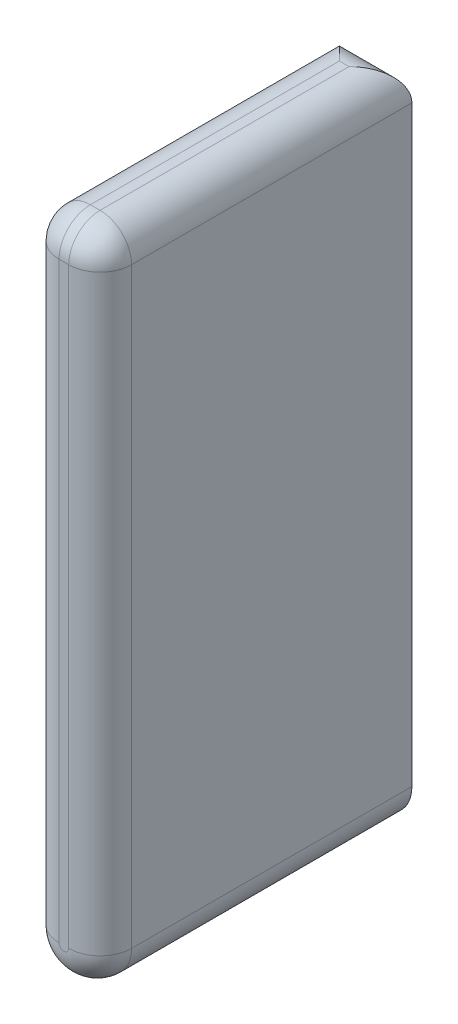
ISO-10303-21;
HEADER;
FILE_DESCRIPTION(('STEP AP214'),'2;1');
FILE_NAME('part.step','',(''),(''),'','','');
FILE_SCHEMA(('AUTOMOTIVE_DESIGN { 1 0 10303 214 1 1 1 1 }'));
ENDSEC;
DATA;
#1=APPLICATION_CONTEXT('core data for automotive mechanical design processes');
#2=APPLICATION_PROTOCOL_DEFINITION('international standard','automotive_design',2000,#1);
#3=PRODUCT_CONTEXT('',#1,'mechanical');
#4=PRODUCT('Part','Part','',(#3));
#5=PRODUCT_RELATED_PRODUCT_CATEGORY('part','',(#4));
#6=PRODUCT_DEFINITION_FORMATION('','',#4);
#7=PRODUCT_DEFINITION_CONTEXT('part definition',#1,'design');
#8=PRODUCT_DEFINITION('design','',#6,#7);
#9=PRODUCT_DEFINITION_SHAPE('','',#8);
#10=(LENGTH_UNIT() NAMED_UNIT(*) SI_UNIT(.MILLI.,.METRE.));
#11=(NAMED_UNIT(*) PLANE_ANGLE_UNIT() SI_UNIT($,.RADIAN.));
#12=(NAMED_UNIT(*) SI_UNIT($,.STERADIAN.) SOLID_ANGLE_UNIT());
#13=UNCERTAINTY_MEASURE_WITH_UNIT(LENGTH_MEASURE(1.E-05),#10,'distance_accuracy_value','');
#14=(GEOMETRIC_REPRESENTATION_CONTEXT(3) GLOBAL_UNCERTAINTY_ASSIGNED_CONTEXT((#13)) GLOBAL_UNIT_ASSIGNED_CONTEXT((#10,
#11,#12)) REPRESENTATION_CONTEXT('',''));
#15=CARTESIAN_POINT('',(0.,0.,0.));
#16=DIRECTION('',(0.,0.,1.));
#17=DIRECTION('',(1.,0.,0.));
#18=AXIS2_PLACEMENT_3D('',#15,#16,#17);
#19=CARTESIAN_POINT('',(0.,0.,645.));
#20=DIRECTION('',(0.,0.,-1.));
#21=DIRECTION('',(-1.,0.,0.));
#22=AXIS2_PLACEMENT_3D('',#19,#20,#21);
#23=CYLINDRICAL_SURFACE('',#22,75.);
#24=DIRECTION('',(0.,0.,-1.));
#25=VECTOR('',#24,1.);
#26=CARTESIAN_POINT('',(75.,0.,4.44089209850063E-13));
#27=LINE('',#26,#25);
#28=CARTESIAN_POINT('',(75.,0.,580.));
#29=VERTEX_POINT('',#28);
#30=CARTESIAN_POINT('',(75.,0.,0.));
#31=VERTEX_POINT('',#30);
#32=EDGE_CURVE('E118',#29,#31,#27,.T.);
#33=ORIENTED_EDGE('',*,*,#32,.F.);
#34=CARTESIAN_POINT('',(0.,0.,580.));
#35=DIRECTION('',(0.,0.,1.));
#36=DIRECTION('',(1.,0.,0.));
#37=AXIS2_PLACEMENT_3D('',#34,#35,#36);
#38=CIRCLE('',#37,75.);
#39=CARTESIAN_POINT('',(-75.,0.,580.));
#40=VERTEX_POINT('',#39);
#41=EDGE_CURVE('E141',#29,#40,#38,.F.);
#42=ORIENTED_EDGE('',*,*,#41,.T.);
#43=DIRECTION('',(0.,0.,1.));
#44=VECTOR('',#43,1.);
#45=CARTESIAN_POINT('',(-75.,0.,4.44089209850063E-13));
#46=LINE('',#45,#44);
#47=CARTESIAN_POINT('',(-75.,0.,0.));
#48=VERTEX_POINT('',#47);
#49=EDGE_CURVE('E123',#48,#40,#46,.T.);
#50=ORIENTED_EDGE('',*,*,#49,.F.);
#51=CARTESIAN_POINT('',(0.,0.,0.));
#52=DIRECTION('',(0.,0.,1.));
#53=DIRECTION('',(1.,0.,0.));
#54=AXIS2_PLACEMENT_3D('',#51,#52,#53);
#55=CIRCLE('',#54,75.);
#56=EDGE_CURVE('E109',#48,#31,#55,.T.);
#57=ORIENTED_EDGE('',*,*,#56,.T.);
#58=EDGE_LOOP('',(#33,#42,#50,#57));
#59=FACE_BOUND('',#58,.T.);
#60=ADVANCED_FACE('F42',(#59),#23,.T.);
#61=CARTESIAN_POINT('',(0.,0.,645.));
#62=DIRECTION('',(0.,0.,1.));
#63=DIRECTION('',(1.,0.,0.));
#64=AXIS2_PLACEMENT_3D('',#61,#62,#63);
#65=PLANE('',#64);
#66=CARTESIAN_POINT('',(0.,0.,645.));
#67=DIRECTION('',(0.,0.,1.));
#68=DIRECTION('',(1.,0.,0.));
#69=AXIS2_PLACEMENT_3D('',#66,#67,#68);
#70=CIRCLE('',#69,9.99999999999998);
#71=CARTESIAN_POINT('',(-9.99999999999998,0.,645.));
#72=VERTEX_POINT('',#71);
#73=CARTESIAN_POINT('',(9.99999999999998,0.,645.));
#74=VERTEX_POINT('',#73);
#75=EDGE_CURVE('E136',#72,#74,#70,.T.);
#76=ORIENTED_EDGE('',*,*,#75,.T.);
#77=DIRECTION('',(0.,-1.,0.));
#78=VECTOR('',#77,1.);
#79=CARTESIAN_POINT('',(9.99999999999998,1290.,645.));
#80=LINE('',#79,#78);
#81=CARTESIAN_POINT('',(9.99999999999998,1225.,645.));
#82=VERTEX_POINT('',#81);
#83=EDGE_CURVE('E138',#74,#82,#80,.F.);
#84=ORIENTED_EDGE('',*,*,#83,.T.);
#85=DIRECTION('',(1.,0.,0.));
#86=VECTOR('',#85,1.);
#87=CARTESIAN_POINT('',(0.,1225.,645.));
#88=LINE('',#87,#86);
#89=CARTESIAN_POINT('',(-9.99999999999998,1225.,645.));
#90=VERTEX_POINT('',#89);
#91=EDGE_CURVE('E134',#82,#90,#88,.F.);
#92=ORIENTED_EDGE('',*,*,#91,.T.);
#93=DIRECTION('',(0.,-1.,0.));
#94=VECTOR('',#93,1.);
#95=CARTESIAN_POINT('',(-9.99999999999998,0.,645.));
#96=LINE('',#95,#94);
#97=EDGE_CURVE('E132',#90,#72,#96,.T.);
#98=ORIENTED_EDGE('',*,*,#97,.T.);
#99=EDGE_LOOP('',(#76,#84,#92,#98));
#100=FACE_BOUND('',#99,.T.);
#101=ADVANCED_FACE('F226',(#100),#65,.T.);
#102=CARTESIAN_POINT('',(0.,0.,0.));
#103=DIRECTION('',(0.,0.,1.));
#104=DIRECTION('',(1.,0.,0.));
#105=AXIS2_PLACEMENT_3D('',#102,#103,#104);
#106=PLANE('',#105);
#107=DIRECTION('',(0.,-1.,0.));
#108=VECTOR('',#107,1.);
#109=CARTESIAN_POINT('',(-75.,1290.,4.44089209850063E-13));
#110=LINE('',#109,#108);
#111=CARTESIAN_POINT('',(-75.,1225.,4.44089209850063E-13));
#112=VERTEX_POINT('',#111);
#113=EDGE_CURVE('E114',#112,#48,#110,.T.);
#114=ORIENTED_EDGE('',*,*,#113,.F.);
#115=DIRECTION('',(-1.,0.,0.));
#116=VECTOR('',#115,1.);
#117=CARTESIAN_POINT('',(75.,1225.,0.));
#118=LINE('',#117,#116);
#119=CARTESIAN_POINT('',(75.,1225.,4.44089209850063E-13));
#120=VERTEX_POINT('',#119);
#121=EDGE_CURVE('E111',#112,#120,#118,.F.);
#122=ORIENTED_EDGE('',*,*,#121,.T.);
#123=DIRECTION('',(0.,-1.,0.));
#124=VECTOR('',#123,1.);
#125=CARTESIAN_POINT('',(75.,1290.,4.44089209850063E-13));
#126=LINE('',#125,#124);
#127=EDGE_CURVE('E105',#120,#31,#126,.T.);
#128=ORIENTED_EDGE('',*,*,#127,.T.);
#129=ORIENTED_EDGE('',*,*,#56,.F.);
#130=EDGE_LOOP('',(#114,#122,#128,#129));
#131=FACE_BOUND('',#130,.T.);
#132=ADVANCED_FACE('F107',(#131),#106,.F.);
#133=CARTESIAN_POINT('',(-75.,1290.,4.44089209850063E-13));
#134=DIRECTION('',(1.,0.,0.));
#135=DIRECTION('',(0.,0.,-1.));
#136=AXIS2_PLACEMENT_3D('',#133,#134,#135);
#137=PLANE('',#136);
#138=DIRECTION('',(0.,-1.,0.));
#139=VECTOR('',#138,1.);
#140=CARTESIAN_POINT('',(-75.,1290.,580.));
#141=LINE('',#140,#139);
#142=CARTESIAN_POINT('',(-75.,1225.,580.));
#143=VERTEX_POINT('',#142);
#144=EDGE_CURVE('E51',#40,#143,#141,.F.);
#145=ORIENTED_EDGE('',*,*,#144,.T.);
#146=DIRECTION('',(0.,0.,1.));
#147=VECTOR('',#146,1.);
#148=CARTESIAN_POINT('',(-75.,1225.,4.44089209850063E-13));
#149=LINE('',#148,#147);
#150=EDGE_CURVE('E11',#143,#112,#149,.F.);
#151=ORIENTED_EDGE('',*,*,#150,.T.);
#152=ORIENTED_EDGE('',*,*,#113,.T.);
#153=ORIENTED_EDGE('',*,*,#49,.T.);
#154=EDGE_LOOP('',(#145,#151,#152,#153));
#155=FACE_BOUND('',#154,.T.);
#156=ADVANCED_FACE('F186',(#155),#137,.F.);
#157=CARTESIAN_POINT('',(75.,1290.,4.44089209850063E-13));
#158=DIRECTION('',(-1.,0.,0.));
#159=DIRECTION('',(0.,0.,1.));
#160=AXIS2_PLACEMENT_3D('',#157,#158,#159);
#161=PLANE('',#160);
#162=DIRECTION('',(0.,0.,-1.));
#163=VECTOR('',#162,1.);
#164=CARTESIAN_POINT('',(75.,1225.,645.));
#165=LINE('',#164,#163);
#166=CARTESIAN_POINT('',(75.,1225.,580.));
#167=VERTEX_POINT('',#166);
#168=EDGE_CURVE('E126',#120,#167,#165,.F.);
#169=ORIENTED_EDGE('',*,*,#168,.T.);
#170=DIRECTION('',(0.,-1.,0.));
#171=VECTOR('',#170,1.);
#172=CARTESIAN_POINT('',(75.,0.,580.));
#173=LINE('',#172,#171);
#174=EDGE_CURVE('E121',#167,#29,#173,.T.);
#175=ORIENTED_EDGE('',*,*,#174,.T.);
#176=ORIENTED_EDGE('',*,*,#32,.T.);
#177=ORIENTED_EDGE('',*,*,#127,.F.);
#178=EDGE_LOOP('',(#169,#175,#176,#177));
#179=FACE_BOUND('',#178,.T.);
#180=ADVANCED_FACE('F119',(#179),#161,.F.);
#181=CARTESIAN_POINT('',(0.,1290.,0.));
#182=DIRECTION('',(0.,1.,0.));
#183=DIRECTION('',(0.,0.,1.));
#184=AXIS2_PLACEMENT_3D('',#181,#182,#183);
#185=PLANE('',#184);
#186=DIRECTION('',(0.,0.,-1.));
#187=VECTOR('',#186,1.);
#188=CARTESIAN_POINT('',(9.99999999999998,1290.,4.44089209850063E-13));
#189=LINE('',#188,#187);
#190=CARTESIAN_POINT('',(9.99999999999998,1290.,580.));
#191=VERTEX_POINT('',#190);
#192=CARTESIAN_POINT('',(9.99999999999998,1290.,65.));
#193=VERTEX_POINT('',#192);
#194=EDGE_CURVE('E147',#191,#193,#189,.T.);
#195=ORIENTED_EDGE('',*,*,#194,.T.);
#196=DIRECTION('',(-1.,0.,0.));
#197=VECTOR('',#196,1.);
#198=CARTESIAN_POINT('',(-75.,1290.,65.));
#199=LINE('',#198,#197);
#200=CARTESIAN_POINT('',(-9.99999999999998,1290.,65.));
#201=VERTEX_POINT('',#200);
#202=EDGE_CURVE('E149',#193,#201,#199,.T.);
#203=ORIENTED_EDGE('',*,*,#202,.T.);
#204=DIRECTION('',(0.,0.,1.));
#205=VECTOR('',#204,1.);
#206=CARTESIAN_POINT('',(-9.99999999999998,1290.,645.));
#207=LINE('',#206,#205);
#208=CARTESIAN_POINT('',(-9.99999999999998,1290.,580.));
#209=VERTEX_POINT('',#208);
#210=EDGE_CURVE('E143',#201,#209,#207,.T.);
#211=ORIENTED_EDGE('',*,*,#210,.T.);
#212=DIRECTION('',(1.,0.,0.));
#213=VECTOR('',#212,1.);
#214=CARTESIAN_POINT('',(0.,1290.,580.));
#215=LINE('',#214,#213);
#216=EDGE_CURVE('E145',#209,#191,#215,.T.);
#217=ORIENTED_EDGE('',*,*,#216,.T.);
#218=EDGE_LOOP('',(#195,#203,#211,#217));
#219=FACE_BOUND('',#218,.T.);
#220=ADVANCED_FACE('F216',(#219),#185,.T.);
#221=CARTESIAN_POINT('',(-9.99999999999998,1225.,0.));
#222=DIRECTION('',(0.,0.,-1.));
#223=DIRECTION('',(-1.,0.,0.));
#224=AXIS2_PLACEMENT_3D('',#221,#222,#223);
#225=CYLINDRICAL_SURFACE('',#224,65.);
#226=CARTESIAN_POINT('',(-9.99999999999998,1225.,580.));
#227=DIRECTION('',(0.,0.,1.));
#228=DIRECTION('',(1.,0.,0.));
#229=AXIS2_PLACEMENT_3D('',#226,#227,#228);
#230=CIRCLE('',#229,65.);
#231=EDGE_CURVE('E175',#209,#143,#230,.T.);
#232=ORIENTED_EDGE('',*,*,#231,.F.);
#233=ORIENTED_EDGE('',*,*,#210,.F.);
#234=CARTESIAN_POINT('',(-9.99999999999998,1225.,65.));
#235=DIRECTION('',(0.707106781186547,0.,-0.707106781186547));
#236=DIRECTION('',(-0.707106781186547,0.,-0.707106781186547));
#237=AXIS2_PLACEMENT_3D('',#234,#235,#236);
#238=ELLIPSE('',#237,91.9238815542512,65.);
#239=EDGE_CURVE('E46',#112,#201,#238,.T.);
#240=ORIENTED_EDGE('',*,*,#239,.F.);
#241=ORIENTED_EDGE('',*,*,#150,.F.);
#242=EDGE_LOOP('',(#232,#233,#240,#241));
#243=FACE_BOUND('',#242,.T.);
#244=ADVANCED_FACE('F44',(#243),#225,.T.);
#245=CARTESIAN_POINT('',(0.,1225.,65.));
#246=DIRECTION('',(1.,0.,0.));
#247=DIRECTION('',(0.,0.,-1.));
#248=AXIS2_PLACEMENT_3D('',#245,#246,#247);
#249=CYLINDRICAL_SURFACE('',#248,65.);
#250=ORIENTED_EDGE('',*,*,#239,.T.);
#251=ORIENTED_EDGE('',*,*,#202,.F.);
#252=CARTESIAN_POINT('',(9.99999999999998,1225.,65.));
#253=DIRECTION('',(0.707106781186547,0.,0.707106781186547));
#254=DIRECTION('',(-0.707106781186547,0.,0.707106781186547));
#255=AXIS2_PLACEMENT_3D('',#252,#253,#254);
#256=ELLIPSE('',#255,91.9238815542512,65.);
#257=EDGE_CURVE('E170',#120,#193,#256,.T.);
#258=ORIENTED_EDGE('',*,*,#257,.F.);
#259=ORIENTED_EDGE('',*,*,#121,.F.);
#260=EDGE_LOOP('',(#250,#251,#258,#259));
#261=FACE_BOUND('',#260,.T.);
#262=ADVANCED_FACE('F188',(#261),#249,.T.);
#263=CARTESIAN_POINT('',(-9.99999999999998,1225.,580.));
#264=DIRECTION('',(0.,1.,0.));
#265=DIRECTION('',(0.,0.,1.));
#266=AXIS2_PLACEMENT_3D('',#263,#264,#265);
#267=SPHERICAL_SURFACE('',#266,65.);
#268=CARTESIAN_POINT('',(-9.99999999999998,1225.,580.));
#269=DIRECTION('',(0.,1.,0.));
#270=DIRECTION('',(0.,0.,1.));
#271=AXIS2_PLACEMENT_3D('',#268,#269,#270);
#272=CIRCLE('',#271,65.);
#273=EDGE_CURVE('E167',#90,#143,#272,.F.);
#274=ORIENTED_EDGE('',*,*,#273,.F.);
#275=CARTESIAN_POINT('',(-9.99999999999998,1225.,580.));
#276=DIRECTION('',(-1.,0.,0.));
#277=DIRECTION('',(0.,0.,1.));
#278=AXIS2_PLACEMENT_3D('',#275,#276,#277);
#279=CIRCLE('',#278,65.);
#280=EDGE_CURVE('E173',#209,#90,#279,.F.);
#281=ORIENTED_EDGE('',*,*,#280,.F.);
#282=ORIENTED_EDGE('',*,*,#231,.T.);
#283=EDGE_LOOP('',(#274,#281,#282));
#284=FACE_BOUND('',#283,.T.);
#285=ADVANCED_FACE('F211',(#284),#267,.T.);
#286=CARTESIAN_POINT('',(0.,1225.,580.));
#287=DIRECTION('',(1.,0.,0.));
#288=DIRECTION('',(0.,0.,-1.));
#289=AXIS2_PLACEMENT_3D('',#286,#287,#288);
#290=CYLINDRICAL_SURFACE('',#289,65.);
#291=ORIENTED_EDGE('',*,*,#280,.T.);
#292=ORIENTED_EDGE('',*,*,#91,.F.);
#293=CARTESIAN_POINT('',(9.99999999999998,1225.,580.));
#294=DIRECTION('',(1.,0.,0.));
#295=DIRECTION('',(0.,0.,-1.));
#296=AXIS2_PLACEMENT_3D('',#293,#294,#295);
#297=CIRCLE('',#296,65.);
#298=EDGE_CURVE('E164',#191,#82,#297,.T.);
#299=ORIENTED_EDGE('',*,*,#298,.F.);
#300=ORIENTED_EDGE('',*,*,#216,.F.);
#301=EDGE_LOOP('',(#291,#292,#299,#300));
#302=FACE_BOUND('',#301,.T.);
#303=ADVANCED_FACE('F214',(#302),#290,.T.);
#304=CARTESIAN_POINT('',(9.99999999999998,1225.,0.));
#305=DIRECTION('',(0.,0.,1.));
#306=DIRECTION('',(1.,0.,0.));
#307=AXIS2_PLACEMENT_3D('',#304,#305,#306);
#308=CYLINDRICAL_SURFACE('',#307,65.);
#309=ORIENTED_EDGE('',*,*,#257,.T.);
#310=ORIENTED_EDGE('',*,*,#194,.F.);
#311=CARTESIAN_POINT('',(9.99999999999998,1225.,580.));
#312=DIRECTION('',(0.,0.,1.));
#313=DIRECTION('',(1.,0.,0.));
#314=AXIS2_PLACEMENT_3D('',#311,#312,#313);
#315=CIRCLE('',#314,65.);
#316=EDGE_CURVE('E161',#167,#191,#315,.T.);
#317=ORIENTED_EDGE('',*,*,#316,.F.);
#318=ORIENTED_EDGE('',*,*,#168,.F.);
#319=EDGE_LOOP('',(#309,#310,#317,#318));
#320=FACE_BOUND('',#319,.T.);
#321=ADVANCED_FACE('F193',(#320),#308,.T.);
#322=CARTESIAN_POINT('',(-9.99999999999998,0.,580.));
#323=DIRECTION('',(0.,1.,0.));
#324=DIRECTION('',(0.,0.,1.));
#325=AXIS2_PLACEMENT_3D('',#322,#323,#324);
#326=CYLINDRICAL_SURFACE('',#325,65.);
#327=ORIENTED_EDGE('',*,*,#273,.T.);
#328=ORIENTED_EDGE('',*,*,#144,.F.);
#329=CARTESIAN_POINT('',(-9.99999999999998,0.,580.));
#330=DIRECTION('',(0.,-1.,0.));
#331=DIRECTION('',(0.,0.,-1.));
#332=AXIS2_PLACEMENT_3D('',#329,#330,#331);
#333=CIRCLE('',#332,65.);
#334=EDGE_CURVE('E158',#72,#40,#333,.T.);
#335=ORIENTED_EDGE('',*,*,#334,.F.);
#336=ORIENTED_EDGE('',*,*,#97,.F.);
#337=EDGE_LOOP('',(#327,#328,#335,#336));
#338=FACE_BOUND('',#337,.T.);
#339=ADVANCED_FACE('F210',(#338),#326,.T.);
#340=CARTESIAN_POINT('',(9.99999999999998,1225.,580.));
#341=DIRECTION('',(0.,1.,0.));
#342=DIRECTION('',(0.,0.,1.));
#343=AXIS2_PLACEMENT_3D('',#340,#341,#342);
#344=SPHERICAL_SURFACE('',#343,65.);
#345=ORIENTED_EDGE('',*,*,#316,.T.);
#346=ORIENTED_EDGE('',*,*,#298,.T.);
#347=CARTESIAN_POINT('',(9.99999999999998,1225.,580.));
#348=DIRECTION('',(0.,1.,0.));
#349=DIRECTION('',(0.,0.,1.));
#350=AXIS2_PLACEMENT_3D('',#347,#348,#349);
#351=CIRCLE('',#350,65.);
#352=EDGE_CURVE('E156',#167,#82,#351,.F.);
#353=ORIENTED_EDGE('',*,*,#352,.F.);
#354=EDGE_LOOP('',(#345,#346,#353));
#355=FACE_BOUND('',#354,.T.);
#356=ADVANCED_FACE('F197',(#355),#344,.T.);
#357=CARTESIAN_POINT('',(0.,0.,580.));
#358=DIRECTION('',(0.,0.,1.));
#359=DIRECTION('',(1.,0.,0.));
#360=AXIS2_PLACEMENT_3D('',#357,#358,#359);
#361=DEGENERATE_TOROIDAL_SURFACE('',#360,9.99999999999998,65.,.T.);
#362=ORIENTED_EDGE('',*,*,#334,.T.);
#363=ORIENTED_EDGE('',*,*,#41,.F.);
#364=CARTESIAN_POINT('',(9.99999999999998,0.,580.));
#365=DIRECTION('',(0.,1.,0.));
#366=DIRECTION('',(0.,0.,1.));
#367=AXIS2_PLACEMENT_3D('',#364,#365,#366);
#368=CIRCLE('',#367,65.);
#369=EDGE_CURVE('E154',#74,#29,#368,.T.);
#370=ORIENTED_EDGE('',*,*,#369,.F.);
#371=ORIENTED_EDGE('',*,*,#75,.F.);
#372=EDGE_LOOP('',(#362,#363,#370,#371));
#373=FACE_BOUND('',#372,.T.);
#374=ADVANCED_FACE('F206',(#373),#361,.T.);
#375=CARTESIAN_POINT('',(9.99999999999998,1290.,580.));
#376=DIRECTION('',(0.,1.,0.));
#377=DIRECTION('',(0.,0.,1.));
#378=AXIS2_PLACEMENT_3D('',#375,#376,#377);
#379=CYLINDRICAL_SURFACE('',#378,65.);
#380=ORIENTED_EDGE('',*,*,#352,.T.);
#381=ORIENTED_EDGE('',*,*,#83,.F.);
#382=ORIENTED_EDGE('',*,*,#369,.T.);
#383=ORIENTED_EDGE('',*,*,#174,.F.);
#384=EDGE_LOOP('',(#380,#381,#382,#383));
#385=FACE_BOUND('',#384,.T.);
#386=ADVANCED_FACE('F201',(#385),#379,.T.);
#387=CLOSED_SHELL('',(#60,#101,#132,#156,#180,#220,#244,#262,#285,#303,#321,#339,#356,#374,#386));
#388=MANIFOLD_SOLID_BREP('B2',#387);
#389=ADVANCED_BREP_SHAPE_REPRESENTATION('',(#18,#388),#14);
#390=SHAPE_DEFINITION_REPRESENTATION(#9,#389);
ENDSEC;
END-ISO-10303-21;
